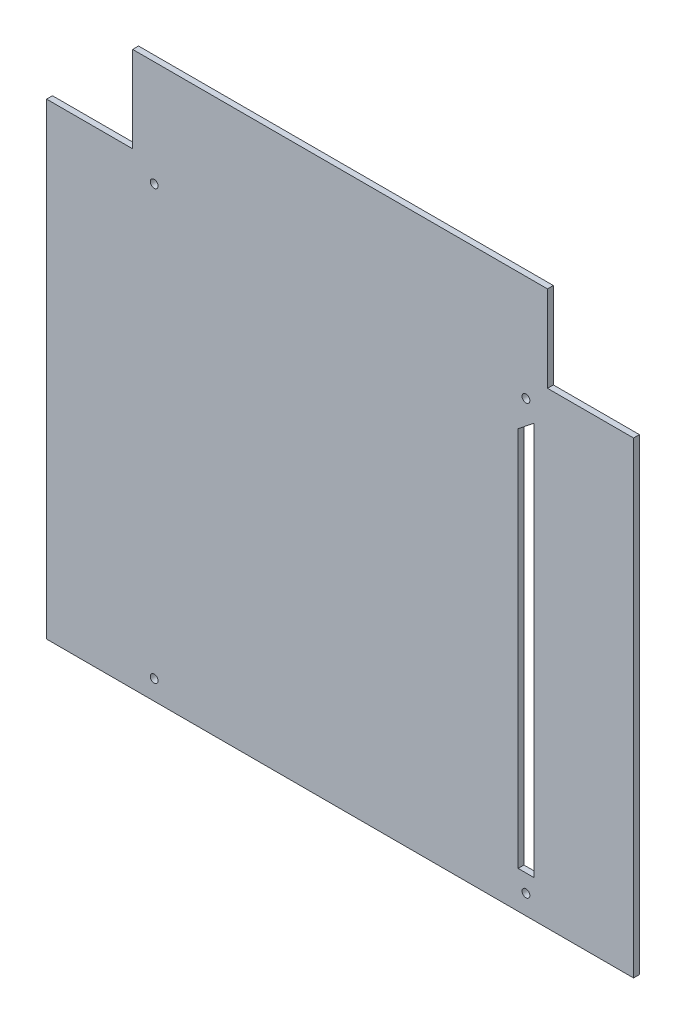
ISO-10303-21;
HEADER;
FILE_DESCRIPTION(('STEP AP214'),'2;1');
FILE_NAME('part.step','',(''),(''),'','','');
FILE_SCHEMA(('AUTOMOTIVE_DESIGN { 1 0 10303 214 1 1 1 1 }'));
ENDSEC;
DATA;
#1=APPLICATION_CONTEXT('core data for automotive mechanical design processes');
#2=APPLICATION_PROTOCOL_DEFINITION('international standard','automotive_design',2000,#1);
#3=PRODUCT_CONTEXT('',#1,'mechanical');
#4=PRODUCT('Part','Part','',(#3));
#5=PRODUCT_RELATED_PRODUCT_CATEGORY('part','',(#4));
#6=PRODUCT_DEFINITION_FORMATION('','',#4);
#7=PRODUCT_DEFINITION_CONTEXT('part definition',#1,'design');
#8=PRODUCT_DEFINITION('design','',#6,#7);
#9=PRODUCT_DEFINITION_SHAPE('','',#8);
#10=(LENGTH_UNIT() NAMED_UNIT(*) SI_UNIT(.MILLI.,.METRE.));
#11=(NAMED_UNIT(*) PLANE_ANGLE_UNIT() SI_UNIT($,.RADIAN.));
#12=(NAMED_UNIT(*) SI_UNIT($,.STERADIAN.) SOLID_ANGLE_UNIT());
#13=UNCERTAINTY_MEASURE_WITH_UNIT(LENGTH_MEASURE(1.E-05),#10,'distance_accuracy_value','');
#14=(GEOMETRIC_REPRESENTATION_CONTEXT(3) GLOBAL_UNCERTAINTY_ASSIGNED_CONTEXT((#13)) GLOBAL_UNIT_ASSIGNED_CONTEXT((#10,
#11,#12)) REPRESENTATION_CONTEXT('',''));
#15=CARTESIAN_POINT('',(0.,0.,0.));
#16=DIRECTION('',(0.,0.,1.));
#17=DIRECTION('',(1.,0.,0.));
#18=AXIS2_PLACEMENT_3D('',#15,#16,#17);
#19=CARTESIAN_POINT('',(0.,-100.5,3.));
#20=DIRECTION('',(0.,-1.,0.));
#21=DIRECTION('',(0.,0.,-1.));
#22=AXIS2_PLACEMENT_3D('',#19,#20,#21);
#23=PLANE('',#22);
#24=DIRECTION('',(-1.,0.,0.));
#25=VECTOR('',#24,1.);
#26=CARTESIAN_POINT('',(0.,-100.5,0.));
#27=LINE('',#26,#25);
#28=CARTESIAN_POINT('',(99.,-100.5,0.));
#29=VERTEX_POINT('',#28);
#30=CARTESIAN_POINT('',(91.,-100.5,0.));
#31=VERTEX_POINT('',#30);
#32=EDGE_CURVE('E190',#29,#31,#27,.T.);
#33=ORIENTED_EDGE('',*,*,#32,.T.);
#34=DIRECTION('',(0.,0.,-1.));
#35=VECTOR('',#34,1.);
#36=CARTESIAN_POINT('',(91.,-100.5,3.));
#37=LINE('',#36,#35);
#38=CARTESIAN_POINT('',(91.,-100.5,3.));
#39=VERTEX_POINT('',#38);
#40=EDGE_CURVE('E11',#39,#31,#37,.T.);
#41=ORIENTED_EDGE('',*,*,#40,.F.);
#42=DIRECTION('',(-1.,0.,0.));
#43=VECTOR('',#42,1.);
#44=CARTESIAN_POINT('',(0.,-100.5,3.));
#45=LINE('',#44,#43);
#46=CARTESIAN_POINT('',(99.,-100.5,3.));
#47=VERTEX_POINT('',#46);
#48=EDGE_CURVE('E139',#47,#39,#45,.T.);
#49=ORIENTED_EDGE('',*,*,#48,.F.);
#50=DIRECTION('',(0.,0.,-1.));
#51=VECTOR('',#50,1.);
#52=CARTESIAN_POINT('',(99.,-100.5,3.));
#53=LINE('',#52,#51);
#54=EDGE_CURVE('E201',#47,#29,#53,.T.);
#55=ORIENTED_EDGE('',*,*,#54,.T.);
#56=EDGE_LOOP('',(#33,#41,#49,#55));
#57=FACE_BOUND('',#56,.T.);
#58=ADVANCED_FACE('F37',(#57),#23,.F.);
#59=CARTESIAN_POINT('',(91.,0.,3.));
#60=DIRECTION('',(-1.,0.,0.));
#61=DIRECTION('',(0.,0.,1.));
#62=AXIS2_PLACEMENT_3D('',#59,#60,#61);
#63=PLANE('',#62);
#64=DIRECTION('',(0.,1.,0.));
#65=VECTOR('',#64,1.);
#66=CARTESIAN_POINT('',(91.,0.,0.));
#67=LINE('',#66,#65);
#68=CARTESIAN_POINT('',(90.9999999999999,94.1266666666667,0.));
#69=VERTEX_POINT('',#68);
#70=EDGE_CURVE('E145',#31,#69,#67,.T.);
#71=ORIENTED_EDGE('',*,*,#70,.T.);
#72=DIRECTION('',(0.,0.,-1.));
#73=VECTOR('',#72,1.);
#74=CARTESIAN_POINT('',(90.9999999999999,94.1266666666667,3.));
#75=LINE('',#74,#73);
#76=CARTESIAN_POINT('',(90.9999999999999,94.1266666666667,3.));
#77=VERTEX_POINT('',#76);
#78=EDGE_CURVE('E47',#77,#69,#75,.T.);
#79=ORIENTED_EDGE('',*,*,#78,.F.);
#80=DIRECTION('',(0.,1.,0.));
#81=VECTOR('',#80,1.);
#82=CARTESIAN_POINT('',(91.,0.,3.));
#83=LINE('',#82,#81);
#84=EDGE_CURVE('E132',#39,#77,#83,.T.);
#85=ORIENTED_EDGE('',*,*,#84,.F.);
#86=ORIENTED_EDGE('',*,*,#40,.T.);
#87=EDGE_LOOP('',(#71,#79,#85,#86));
#88=FACE_BOUND('',#87,.T.);
#89=ADVANCED_FACE('F144',(#88),#63,.F.);
#90=CARTESIAN_POINT('',(-10.5414658682309,13.231965524976,3.));
#91=DIRECTION('',(0.623104039663693,-0.782138961920953,0.));
#92=DIRECTION('',(0.782138961920954,0.623104039663693,0.));
#93=AXIS2_PLACEMENT_3D('',#90,#91,#92);
#94=PLANE('',#93);
#95=DIRECTION('',(-0.782138961920953,-0.623104039663693,0.));
#96=VECTOR('',#95,1.);
#97=CARTESIAN_POINT('',(-10.5414658682309,13.231965524976,0.));
#98=LINE('',#97,#96);
#99=CARTESIAN_POINT('',(98.9999999999999,100.5,0.));
#100=VERTEX_POINT('',#99);
#101=EDGE_CURVE('E194',#100,#69,#98,.T.);
#102=ORIENTED_EDGE('',*,*,#101,.F.);
#103=DIRECTION('',(0.,0.,-1.));
#104=VECTOR('',#103,1.);
#105=CARTESIAN_POINT('',(98.9999999999999,100.5,3.));
#106=LINE('',#105,#104);
#107=CARTESIAN_POINT('',(98.9999999999999,100.5,3.));
#108=VERTEX_POINT('',#107);
#109=EDGE_CURVE('E96',#108,#100,#106,.T.);
#110=ORIENTED_EDGE('',*,*,#109,.F.);
#111=DIRECTION('',(-0.782138961920953,-0.623104039663693,0.));
#112=VECTOR('',#111,1.);
#113=CARTESIAN_POINT('',(-10.5414658682309,13.231965524976,3.));
#114=LINE('',#113,#112);
#115=EDGE_CURVE('E137',#108,#77,#114,.T.);
#116=ORIENTED_EDGE('',*,*,#115,.T.);
#117=ORIENTED_EDGE('',*,*,#78,.T.);
#118=EDGE_LOOP('',(#102,#110,#116,#117));
#119=FACE_BOUND('',#118,.T.);
#120=ADVANCED_FACE('F150',(#119),#94,.T.);
#121=CARTESIAN_POINT('',(-150.,0.,3.));
#122=DIRECTION('',(-1.,0.,0.));
#123=DIRECTION('',(0.,0.,1.));
#124=AXIS2_PLACEMENT_3D('',#121,#122,#123);
#125=PLANE('',#124);
#126=DIRECTION('',(0.,1.,0.));
#127=VECTOR('',#126,1.);
#128=CARTESIAN_POINT('',(-150.,0.,0.));
#129=LINE('',#128,#127);
#130=CARTESIAN_POINT('',(-150.,-119.5,0.));
#131=VERTEX_POINT('',#130);
#132=CARTESIAN_POINT('',(-150.,119.5,0.));
#133=VERTEX_POINT('',#132);
#134=EDGE_CURVE('E168',#131,#133,#129,.T.);
#135=ORIENTED_EDGE('',*,*,#134,.F.);
#136=DIRECTION('',(0.,0.,-1.));
#137=VECTOR('',#136,1.);
#138=CARTESIAN_POINT('',(-150.,-119.5,3.));
#139=LINE('',#138,#137);
#140=CARTESIAN_POINT('',(-150.,-119.5,3.));
#141=VERTEX_POINT('',#140);
#142=EDGE_CURVE('E41',#141,#131,#139,.T.);
#143=ORIENTED_EDGE('',*,*,#142,.F.);
#144=DIRECTION('',(0.,1.,0.));
#145=VECTOR('',#144,1.);
#146=CARTESIAN_POINT('',(-150.,0.,3.));
#147=LINE('',#146,#145);
#148=CARTESIAN_POINT('',(-150.,119.5,3.));
#149=VERTEX_POINT('',#148);
#150=EDGE_CURVE('E249',#141,#149,#147,.T.);
#151=ORIENTED_EDGE('',*,*,#150,.T.);
#152=DIRECTION('',(0.,0.,-1.));
#153=VECTOR('',#152,1.);
#154=CARTESIAN_POINT('',(-150.,119.5,3.));
#155=LINE('',#154,#153);
#156=EDGE_CURVE('E158',#149,#133,#155,.T.);
#157=ORIENTED_EDGE('',*,*,#156,.T.);
#158=EDGE_LOOP('',(#135,#143,#151,#157));
#159=FACE_BOUND('',#158,.T.);
#160=ADVANCED_FACE('F227',(#159),#125,.T.);
#161=CARTESIAN_POINT('',(0.,-119.5,3.));
#162=DIRECTION('',(0.,-1.,0.));
#163=DIRECTION('',(0.,0.,-1.));
#164=AXIS2_PLACEMENT_3D('',#161,#162,#163);
#165=PLANE('',#164);
#166=DIRECTION('',(-1.,0.,0.));
#167=VECTOR('',#166,1.);
#168=CARTESIAN_POINT('',(0.,-119.5,0.));
#169=LINE('',#168,#167);
#170=CARTESIAN_POINT('',(150.,-119.5,0.));
#171=VERTEX_POINT('',#170);
#172=EDGE_CURVE('E171',#171,#131,#169,.T.);
#173=ORIENTED_EDGE('',*,*,#172,.F.);
#174=DIRECTION('',(0.,0.,-1.));
#175=VECTOR('',#174,1.);
#176=CARTESIAN_POINT('',(150.,-119.5,3.));
#177=LINE('',#176,#175);
#178=CARTESIAN_POINT('',(150.,-119.5,3.));
#179=VERTEX_POINT('',#178);
#180=EDGE_CURVE('E217',#179,#171,#177,.T.);
#181=ORIENTED_EDGE('',*,*,#180,.F.);
#182=DIRECTION('',(-1.,0.,0.));
#183=VECTOR('',#182,1.);
#184=CARTESIAN_POINT('',(0.,-119.5,3.));
#185=LINE('',#184,#183);
#186=EDGE_CURVE('E226',#179,#141,#185,.T.);
#187=ORIENTED_EDGE('',*,*,#186,.T.);
#188=ORIENTED_EDGE('',*,*,#142,.T.);
#189=EDGE_LOOP('',(#173,#181,#187,#188));
#190=FACE_BOUND('',#189,.T.);
#191=ADVANCED_FACE('F224',(#190),#165,.T.);
#192=CARTESIAN_POINT('',(150.,0.,3.));
#193=DIRECTION('',(-1.,0.,0.));
#194=DIRECTION('',(0.,0.,1.));
#195=AXIS2_PLACEMENT_3D('',#192,#193,#194);
#196=PLANE('',#195);
#197=DIRECTION('',(0.,1.,0.));
#198=VECTOR('',#197,1.);
#199=CARTESIAN_POINT('',(150.,0.,0.));
#200=LINE('',#199,#198);
#201=CARTESIAN_POINT('',(150.,119.5,0.));
#202=VERTEX_POINT('',#201);
#203=EDGE_CURVE('E174',#171,#202,#200,.T.);
#204=ORIENTED_EDGE('',*,*,#203,.T.);
#205=DIRECTION('',(0.,0.,-1.));
#206=VECTOR('',#205,1.);
#207=CARTESIAN_POINT('',(150.,119.5,3.));
#208=LINE('',#207,#206);
#209=CARTESIAN_POINT('',(150.,119.5,3.));
#210=VERTEX_POINT('',#209);
#211=EDGE_CURVE('E215',#210,#202,#208,.T.);
#212=ORIENTED_EDGE('',*,*,#211,.F.);
#213=DIRECTION('',(0.,1.,0.));
#214=VECTOR('',#213,1.);
#215=CARTESIAN_POINT('',(150.,0.,3.));
#216=LINE('',#215,#214);
#217=EDGE_CURVE('E237',#179,#210,#216,.T.);
#218=ORIENTED_EDGE('',*,*,#217,.F.);
#219=ORIENTED_EDGE('',*,*,#180,.T.);
#220=EDGE_LOOP('',(#204,#212,#218,#219));
#221=FACE_BOUND('',#220,.T.);
#222=ADVANCED_FACE('F235',(#221),#196,.F.);
#223=CARTESIAN_POINT('',(0.,119.5,3.));
#224=DIRECTION('',(0.,-1.,0.));
#225=DIRECTION('',(0.,0.,-1.));
#226=AXIS2_PLACEMENT_3D('',#223,#224,#225);
#227=PLANE('',#226);
#228=DIRECTION('',(-1.,0.,0.));
#229=VECTOR('',#228,1.);
#230=CARTESIAN_POINT('',(0.,119.5,0.));
#231=LINE('',#230,#229);
#232=CARTESIAN_POINT('',(106.,119.5,0.));
#233=VERTEX_POINT('',#232);
#234=EDGE_CURVE('E177',#202,#233,#231,.T.);
#235=ORIENTED_EDGE('',*,*,#234,.T.);
#236=DIRECTION('',(0.,0.,-1.));
#237=VECTOR('',#236,1.);
#238=CARTESIAN_POINT('',(106.,119.5,3.));
#239=LINE('',#238,#237);
#240=CARTESIAN_POINT('',(106.,119.5,3.));
#241=VERTEX_POINT('',#240);
#242=EDGE_CURVE('E212',#241,#233,#239,.T.);
#243=ORIENTED_EDGE('',*,*,#242,.F.);
#244=DIRECTION('',(-1.,0.,0.));
#245=VECTOR('',#244,1.);
#246=CARTESIAN_POINT('',(0.,119.5,3.));
#247=LINE('',#246,#245);
#248=EDGE_CURVE('E242',#210,#241,#247,.T.);
#249=ORIENTED_EDGE('',*,*,#248,.F.);
#250=ORIENTED_EDGE('',*,*,#211,.T.);
#251=EDGE_LOOP('',(#235,#243,#249,#250));
#252=FACE_BOUND('',#251,.T.);
#253=ADVANCED_FACE('F239',(#252),#227,.F.);
#254=CARTESIAN_POINT('',(106.,0.,3.));
#255=DIRECTION('',(-1.,0.,0.));
#256=DIRECTION('',(0.,0.,1.));
#257=AXIS2_PLACEMENT_3D('',#254,#255,#256);
#258=PLANE('',#257);
#259=DIRECTION('',(0.,1.,0.));
#260=VECTOR('',#259,1.);
#261=CARTESIAN_POINT('',(106.,0.,0.));
#262=LINE('',#261,#260);
#263=CARTESIAN_POINT('',(106.,163.5,0.));
#264=VERTEX_POINT('',#263);
#265=EDGE_CURVE('E180',#233,#264,#262,.T.);
#266=ORIENTED_EDGE('',*,*,#265,.T.);
#267=DIRECTION('',(0.,0.,-1.));
#268=VECTOR('',#267,1.);
#269=CARTESIAN_POINT('',(106.,163.5,3.));
#270=LINE('',#269,#268);
#271=CARTESIAN_POINT('',(106.,163.5,3.));
#272=VERTEX_POINT('',#271);
#273=EDGE_CURVE('E209',#272,#264,#270,.T.);
#274=ORIENTED_EDGE('',*,*,#273,.F.);
#275=DIRECTION('',(0.,1.,0.));
#276=VECTOR('',#275,1.);
#277=CARTESIAN_POINT('',(106.,0.,3.));
#278=LINE('',#277,#276);
#279=EDGE_CURVE('E245',#241,#272,#278,.T.);
#280=ORIENTED_EDGE('',*,*,#279,.F.);
#281=ORIENTED_EDGE('',*,*,#242,.T.);
#282=EDGE_LOOP('',(#266,#274,#280,#281));
#283=FACE_BOUND('',#282,.T.);
#284=ADVANCED_FACE('F315',(#283),#258,.F.);
#285=CARTESIAN_POINT('',(0.,163.5,3.));
#286=DIRECTION('',(0.,-1.,0.));
#287=DIRECTION('',(1.,0.,0.));
#288=AXIS2_PLACEMENT_3D('',#285,#286,#287);
#289=PLANE('',#288);
#290=DIRECTION('',(-1.,0.,0.));
#291=VECTOR('',#290,1.);
#292=CARTESIAN_POINT('',(0.,163.5,0.));
#293=LINE('',#292,#291);
#294=CARTESIAN_POINT('',(-106.,163.5,0.));
#295=VERTEX_POINT('',#294);
#296=EDGE_CURVE('E184',#264,#295,#293,.T.);
#297=ORIENTED_EDGE('',*,*,#296,.T.);
#298=DIRECTION('',(0.,0.,-1.));
#299=VECTOR('',#298,1.);
#300=CARTESIAN_POINT('',(-106.,163.5,3.));
#301=LINE('',#300,#299);
#302=CARTESIAN_POINT('',(-106.,163.5,3.));
#303=VERTEX_POINT('',#302);
#304=EDGE_CURVE('E207',#303,#295,#301,.T.);
#305=ORIENTED_EDGE('',*,*,#304,.F.);
#306=DIRECTION('',(-1.,0.,0.));
#307=VECTOR('',#306,1.);
#308=CARTESIAN_POINT('',(0.,163.5,3.));
#309=LINE('',#308,#307);
#310=EDGE_CURVE('E254',#272,#303,#309,.T.);
#311=ORIENTED_EDGE('',*,*,#310,.F.);
#312=ORIENTED_EDGE('',*,*,#273,.T.);
#313=EDGE_LOOP('',(#297,#305,#311,#312));
#314=FACE_BOUND('',#313,.T.);
#315=ADVANCED_FACE('F311',(#314),#289,.F.);
#316=CARTESIAN_POINT('',(-106.,0.,3.));
#317=DIRECTION('',(-1.,0.,0.));
#318=DIRECTION('',(0.,0.,1.));
#319=AXIS2_PLACEMENT_3D('',#316,#317,#318);
#320=PLANE('',#319);
#321=DIRECTION('',(0.,1.,0.));
#322=VECTOR('',#321,1.);
#323=CARTESIAN_POINT('',(-106.,0.,0.));
#324=LINE('',#323,#322);
#325=CARTESIAN_POINT('',(-106.,119.5,0.));
#326=VERTEX_POINT('',#325);
#327=EDGE_CURVE('E187',#326,#295,#324,.T.);
#328=ORIENTED_EDGE('',*,*,#327,.F.);
#329=DIRECTION('',(0.,0.,-1.));
#330=VECTOR('',#329,1.);
#331=CARTESIAN_POINT('',(-106.,119.5,3.));
#332=LINE('',#331,#330);
#333=CARTESIAN_POINT('',(-106.,119.5,3.));
#334=VERTEX_POINT('',#333);
#335=EDGE_CURVE('E205',#334,#326,#332,.T.);
#336=ORIENTED_EDGE('',*,*,#335,.F.);
#337=DIRECTION('',(0.,1.,0.));
#338=VECTOR('',#337,1.);
#339=CARTESIAN_POINT('',(-106.,0.,3.));
#340=LINE('',#339,#338);
#341=EDGE_CURVE('E256',#334,#303,#340,.T.);
#342=ORIENTED_EDGE('',*,*,#341,.T.);
#343=ORIENTED_EDGE('',*,*,#304,.T.);
#344=EDGE_LOOP('',(#328,#336,#342,#343));
#345=FACE_BOUND('',#344,.T.);
#346=ADVANCED_FACE('F308',(#345),#320,.T.);
#347=CARTESIAN_POINT('',(99.,0.,3.));
#348=DIRECTION('',(1.,0.,0.));
#349=DIRECTION('',(0.,1.,0.));
#350=AXIS2_PLACEMENT_3D('',#347,#348,#349);
#351=PLANE('',#350);
#352=DIRECTION('',(0.,-1.,0.));
#353=VECTOR('',#352,1.);
#354=CARTESIAN_POINT('',(99.,0.,0.));
#355=LINE('',#354,#353);
#356=EDGE_CURVE('E99',#100,#29,#355,.T.);
#357=ORIENTED_EDGE('',*,*,#356,.T.);
#358=ORIENTED_EDGE('',*,*,#54,.F.);
#359=DIRECTION('',(0.,-1.,0.));
#360=VECTOR('',#359,1.);
#361=CARTESIAN_POINT('',(99.,0.,3.));
#362=LINE('',#361,#360);
#363=EDGE_CURVE('E56',#108,#47,#362,.T.);
#364=ORIENTED_EDGE('',*,*,#363,.F.);
#365=ORIENTED_EDGE('',*,*,#109,.T.);
#366=EDGE_LOOP('',(#357,#358,#364,#365));
#367=FACE_BOUND('',#366,.T.);
#368=ADVANCED_FACE('F296',(#367),#351,.F.);
#369=EDGE_CURVE('E181',#326,#133,#231,.T.);
#370=ORIENTED_EDGE('',*,*,#369,.T.);
#371=ORIENTED_EDGE('',*,*,#156,.F.);
#372=EDGE_CURVE('E247',#334,#149,#247,.T.);
#373=ORIENTED_EDGE('',*,*,#372,.F.);
#374=ORIENTED_EDGE('',*,*,#335,.T.);
#375=EDGE_LOOP('',(#370,#371,#373,#374));
#376=FACE_BOUND('',#375,.T.);
#377=ADVANCED_FACE('F261',(#376),#227,.F.);
#378=CARTESIAN_POINT('',(-95.0000000000001,109.5,3.));
#379=DIRECTION('',(0.,0.,-1.));
#380=DIRECTION('',(-1.,0.,0.));
#381=AXIS2_PLACEMENT_3D('',#378,#379,#380);
#382=CYLINDRICAL_SURFACE('',#381,2.00000000000001);
#383=CARTESIAN_POINT('',(-95.0000000000001,109.5,3.));
#384=DIRECTION('',(0.,0.,1.));
#385=DIRECTION('',(1.,0.,0.));
#386=AXIS2_PLACEMENT_3D('',#383,#384,#385);
#387=CIRCLE('',#386,2.00000000000001);
#388=CARTESIAN_POINT('',(-93.,109.5,3.));
#389=VERTEX_POINT('',#388);
#390=EDGE_CURVE('E262',#389,#389,#387,.T.);
#391=ORIENTED_EDGE('',*,*,#390,.T.);
#392=EDGE_LOOP('',(#391));
#393=FACE_BOUND('',#392,.T.);
#394=CARTESIAN_POINT('',(-95.0000000000001,109.5,0.));
#395=DIRECTION('',(0.,0.,1.));
#396=DIRECTION('',(1.,0.,0.));
#397=AXIS2_PLACEMENT_3D('',#394,#395,#396);
#398=CIRCLE('',#397,2.00000000000001);
#399=CARTESIAN_POINT('',(-93.,109.5,0.));
#400=VERTEX_POINT('',#399);
#401=EDGE_CURVE('E165',#400,#400,#398,.T.);
#402=ORIENTED_EDGE('',*,*,#401,.F.);
#403=EDGE_LOOP('',(#402));
#404=FACE_BOUND('',#403,.T.);
#405=ADVANCED_FACE('F287',(#393,#404),#382,.F.);
#406=CARTESIAN_POINT('',(94.9999999999999,109.5,3.));
#407=DIRECTION('',(0.,0.,-1.));
#408=DIRECTION('',(-1.,0.,0.));
#409=AXIS2_PLACEMENT_3D('',#406,#407,#408);
#410=CYLINDRICAL_SURFACE('',#409,2.00000000000001);
#411=CARTESIAN_POINT('',(94.9999999999999,109.5,3.));
#412=DIRECTION('',(0.,0.,1.));
#413=DIRECTION('',(1.,0.,0.));
#414=AXIS2_PLACEMENT_3D('',#411,#412,#413);
#415=CIRCLE('',#414,2.00000000000001);
#416=CARTESIAN_POINT('',(97.,109.5,3.));
#417=VERTEX_POINT('',#416);
#418=EDGE_CURVE('E264',#417,#417,#415,.T.);
#419=ORIENTED_EDGE('',*,*,#418,.T.);
#420=EDGE_LOOP('',(#419));
#421=FACE_BOUND('',#420,.T.);
#422=CARTESIAN_POINT('',(94.9999999999999,109.5,0.));
#423=DIRECTION('',(0.,0.,1.));
#424=DIRECTION('',(1.,0.,0.));
#425=AXIS2_PLACEMENT_3D('',#422,#423,#424);
#426=CIRCLE('',#425,2.00000000000001);
#427=CARTESIAN_POINT('',(97.,109.5,0.));
#428=VERTEX_POINT('',#427);
#429=EDGE_CURVE('E162',#428,#428,#426,.T.);
#430=ORIENTED_EDGE('',*,*,#429,.F.);
#431=EDGE_LOOP('',(#430));
#432=FACE_BOUND('',#431,.T.);
#433=ADVANCED_FACE('F277',(#421,#432),#410,.F.);
#434=CARTESIAN_POINT('',(95.,-109.5,3.));
#435=DIRECTION('',(0.,0.,-1.));
#436=DIRECTION('',(-1.,0.,0.));
#437=AXIS2_PLACEMENT_3D('',#434,#435,#436);
#438=CYLINDRICAL_SURFACE('',#437,2.00000000000001);
#439=CARTESIAN_POINT('',(95.,-109.5,3.));
#440=DIRECTION('',(0.,0.,1.));
#441=DIRECTION('',(1.,0.,0.));
#442=AXIS2_PLACEMENT_3D('',#439,#440,#441);
#443=CIRCLE('',#442,2.00000000000001);
#444=CARTESIAN_POINT('',(97.,-109.5,3.));
#445=VERTEX_POINT('',#444);
#446=EDGE_CURVE('E200',#445,#445,#443,.F.);
#447=ORIENTED_EDGE('',*,*,#446,.F.);
#448=EDGE_LOOP('',(#447));
#449=FACE_BOUND('',#448,.T.);
#450=CARTESIAN_POINT('',(95.,-109.5,0.));
#451=DIRECTION('',(0.,0.,1.));
#452=DIRECTION('',(1.,0.,0.));
#453=AXIS2_PLACEMENT_3D('',#450,#451,#452);
#454=CIRCLE('',#453,2.00000000000001);
#455=CARTESIAN_POINT('',(97.,-109.5,0.));
#456=VERTEX_POINT('',#455);
#457=EDGE_CURVE('E159',#456,#456,#454,.F.);
#458=ORIENTED_EDGE('',*,*,#457,.T.);
#459=EDGE_LOOP('',(#458));
#460=FACE_BOUND('',#459,.T.);
#461=ADVANCED_FACE('F39',(#449,#460),#438,.F.);
#462=CARTESIAN_POINT('',(-95.,-109.5,3.));
#463=DIRECTION('',(0.,0.,-1.));
#464=DIRECTION('',(-1.,0.,0.));
#465=AXIS2_PLACEMENT_3D('',#462,#463,#464);
#466=CYLINDRICAL_SURFACE('',#465,2.00000000000001);
#467=CARTESIAN_POINT('',(-95.,-109.5,3.));
#468=DIRECTION('',(0.,0.,1.));
#469=DIRECTION('',(1.,0.,0.));
#470=AXIS2_PLACEMENT_3D('',#467,#468,#469);
#471=CIRCLE('',#470,2.00000000000001);
#472=CARTESIAN_POINT('',(-93.,-109.5,3.));
#473=VERTEX_POINT('',#472);
#474=EDGE_CURVE('E152',#473,#473,#471,.F.);
#475=ORIENTED_EDGE('',*,*,#474,.F.);
#476=EDGE_LOOP('',(#475));
#477=FACE_BOUND('',#476,.T.);
#478=CARTESIAN_POINT('',(-95.,-109.5,0.));
#479=DIRECTION('',(0.,0.,1.));
#480=DIRECTION('',(1.,0.,0.));
#481=AXIS2_PLACEMENT_3D('',#478,#479,#480);
#482=CIRCLE('',#481,2.00000000000001);
#483=CARTESIAN_POINT('',(-93.,-109.5,0.));
#484=VERTEX_POINT('',#483);
#485=EDGE_CURVE('E197',#484,#484,#482,.F.);
#486=ORIENTED_EDGE('',*,*,#485,.T.);
#487=EDGE_LOOP('',(#486));
#488=FACE_BOUND('',#487,.T.);
#489=ADVANCED_FACE('F276',(#477,#488),#466,.F.);
#490=CARTESIAN_POINT('',(0.,0.,3.));
#491=DIRECTION('',(0.,0.,1.));
#492=DIRECTION('',(1.,0.,0.));
#493=AXIS2_PLACEMENT_3D('',#490,#491,#492);
#494=PLANE('',#493);
#495=ORIENTED_EDGE('',*,*,#446,.T.);
#496=EDGE_LOOP('',(#495));
#497=FACE_BOUND('',#496,.T.);
#498=ORIENTED_EDGE('',*,*,#418,.F.);
#499=EDGE_LOOP('',(#498));
#500=FACE_BOUND('',#499,.T.);
#501=ORIENTED_EDGE('',*,*,#390,.F.);
#502=EDGE_LOOP('',(#501));
#503=FACE_BOUND('',#502,.T.);
#504=ORIENTED_EDGE('',*,*,#150,.F.);
#505=ORIENTED_EDGE('',*,*,#186,.F.);
#506=ORIENTED_EDGE('',*,*,#217,.T.);
#507=ORIENTED_EDGE('',*,*,#248,.T.);
#508=ORIENTED_EDGE('',*,*,#279,.T.);
#509=ORIENTED_EDGE('',*,*,#310,.T.);
#510=ORIENTED_EDGE('',*,*,#341,.F.);
#511=ORIENTED_EDGE('',*,*,#372,.T.);
#512=EDGE_LOOP('',(#504,#505,#506,#507,#508,#509,#510,#511));
#513=FACE_BOUND('',#512,.T.);
#514=ORIENTED_EDGE('',*,*,#48,.T.);
#515=ORIENTED_EDGE('',*,*,#84,.T.);
#516=ORIENTED_EDGE('',*,*,#115,.F.);
#517=ORIENTED_EDGE('',*,*,#363,.T.);
#518=EDGE_LOOP('',(#514,#515,#516,#517));
#519=FACE_BOUND('',#518,.T.);
#520=ORIENTED_EDGE('',*,*,#474,.T.);
#521=EDGE_LOOP('',(#520));
#522=FACE_BOUND('',#521,.T.);
#523=ADVANCED_FACE('F134',(#497,#500,#503,#513,#519,#522),#494,.T.);
#524=CARTESIAN_POINT('',(0.,0.,0.));
#525=DIRECTION('',(0.,0.,1.));
#526=DIRECTION('',(1.,0.,0.));
#527=AXIS2_PLACEMENT_3D('',#524,#525,#526);
#528=PLANE('',#527);
#529=ORIENTED_EDGE('',*,*,#457,.F.);
#530=EDGE_LOOP('',(#529));
#531=FACE_BOUND('',#530,.T.);
#532=ORIENTED_EDGE('',*,*,#429,.T.);
#533=EDGE_LOOP('',(#532));
#534=FACE_BOUND('',#533,.T.);
#535=ORIENTED_EDGE('',*,*,#401,.T.);
#536=EDGE_LOOP('',(#535));
#537=FACE_BOUND('',#536,.T.);
#538=ORIENTED_EDGE('',*,*,#134,.T.);
#539=ORIENTED_EDGE('',*,*,#369,.F.);
#540=ORIENTED_EDGE('',*,*,#327,.T.);
#541=ORIENTED_EDGE('',*,*,#296,.F.);
#542=ORIENTED_EDGE('',*,*,#265,.F.);
#543=ORIENTED_EDGE('',*,*,#234,.F.);
#544=ORIENTED_EDGE('',*,*,#203,.F.);
#545=ORIENTED_EDGE('',*,*,#172,.T.);
#546=EDGE_LOOP('',(#538,#539,#540,#541,#542,#543,#544,#545));
#547=FACE_BOUND('',#546,.T.);
#548=ORIENTED_EDGE('',*,*,#32,.F.);
#549=ORIENTED_EDGE('',*,*,#356,.F.);
#550=ORIENTED_EDGE('',*,*,#101,.T.);
#551=ORIENTED_EDGE('',*,*,#70,.F.);
#552=EDGE_LOOP('',(#548,#549,#550,#551));
#553=FACE_BOUND('',#552,.T.);
#554=ORIENTED_EDGE('',*,*,#485,.F.);
#555=EDGE_LOOP('',(#554));
#556=FACE_BOUND('',#555,.T.);
#557=ADVANCED_FACE('F232',(#531,#534,#537,#547,#553,#556),#528,.F.);
#558=CLOSED_SHELL('',(#58,#89,#120,#160,#191,#222,#253,#284,#315,#346,#368,#377,#405,#433,#461,
#489,#523,#557));
#559=MANIFOLD_SOLID_BREP('B2',#558);
#560=ADVANCED_BREP_SHAPE_REPRESENTATION('',(#18,#559),#14);
#561=SHAPE_DEFINITION_REPRESENTATION(#9,#560);
ENDSEC;
END-ISO-10303-21;
